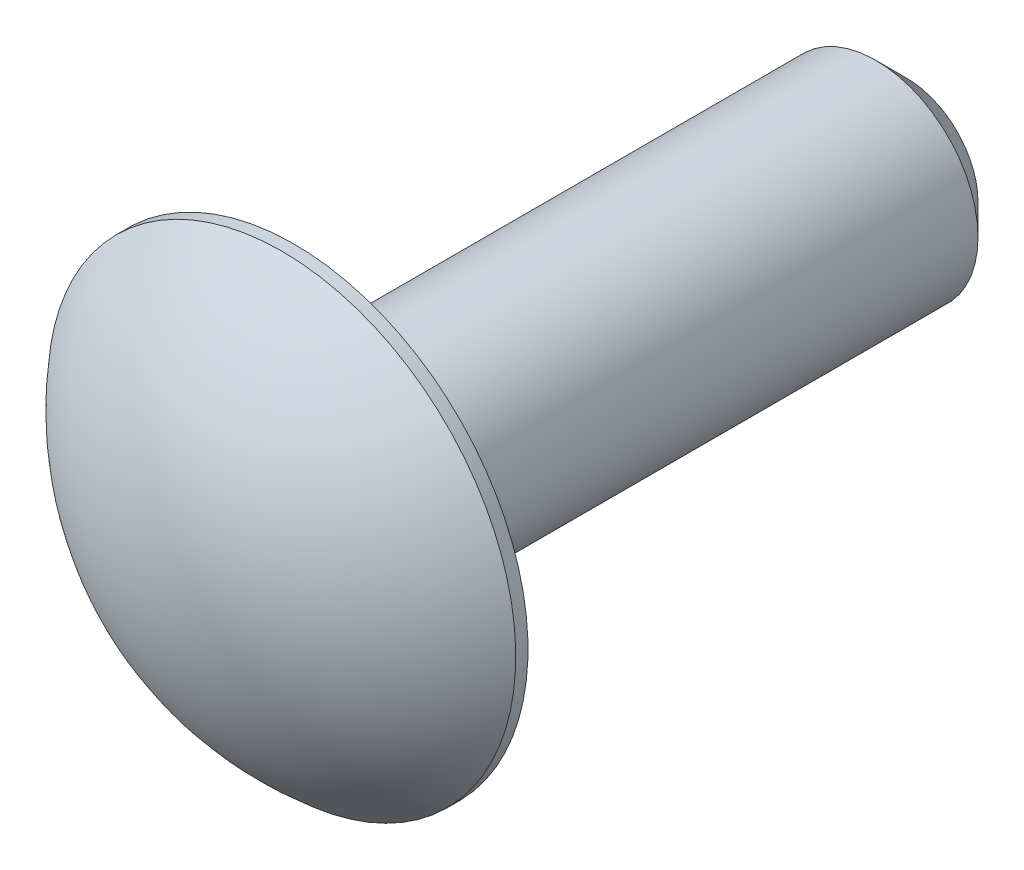
ISO-10303-21;
HEADER;
FILE_DESCRIPTION(('STEP AP214'),'2;1');
FILE_NAME('part.step','',(''),(''),'','','');
FILE_SCHEMA(('AUTOMOTIVE_DESIGN { 1 0 10303 214 1 1 1 1 }'));
ENDSEC;
DATA;
#1=APPLICATION_CONTEXT('core data for automotive mechanical design processes');
#2=APPLICATION_PROTOCOL_DEFINITION('international standard','automotive_design',2000,#1);
#3=PRODUCT_CONTEXT('',#1,'mechanical');
#4=PRODUCT('Part','Part','',(#3));
#5=PRODUCT_RELATED_PRODUCT_CATEGORY('part','',(#4));
#6=PRODUCT_DEFINITION_FORMATION('','',#4);
#7=PRODUCT_DEFINITION_CONTEXT('part definition',#1,'design');
#8=PRODUCT_DEFINITION('design','',#6,#7);
#9=PRODUCT_DEFINITION_SHAPE('','',#8);
#10=(LENGTH_UNIT() NAMED_UNIT(*) SI_UNIT(.MILLI.,.METRE.));
#11=(NAMED_UNIT(*) PLANE_ANGLE_UNIT() SI_UNIT($,.RADIAN.));
#12=(NAMED_UNIT(*) SI_UNIT($,.STERADIAN.) SOLID_ANGLE_UNIT());
#13=UNCERTAINTY_MEASURE_WITH_UNIT(LENGTH_MEASURE(1.E-05),#10,'distance_accuracy_value','');
#14=(GEOMETRIC_REPRESENTATION_CONTEXT(3) GLOBAL_UNCERTAINTY_ASSIGNED_CONTEXT((#13)) GLOBAL_UNIT_ASSIGNED_CONTEXT((#10,
#11,#12)) REPRESENTATION_CONTEXT('',''));
#15=CARTESIAN_POINT('',(0.,0.,0.));
#16=DIRECTION('',(0.,0.,1.));
#17=DIRECTION('',(1.,0.,0.));
#18=AXIS2_PLACEMENT_3D('',#15,#16,#17);
#19=CARTESIAN_POINT('',(0.,0.,0.));
#20=DIRECTION('',(0.,0.,1.));
#21=DIRECTION('',(1.,0.,0.));
#22=AXIS2_PLACEMENT_3D('',#19,#20,#21);
#23=PLANE('',#22);
#24=CARTESIAN_POINT('',(0.,0.,0.));
#25=DIRECTION('',(0.,0.,1.));
#26=DIRECTION('',(1.,0.,0.));
#27=AXIS2_PLACEMENT_3D('',#24,#25,#26);
#28=CIRCLE('',#27,7.2771);
#29=CARTESIAN_POINT('',(-7.2771,0.,0.));
#30=VERTEX_POINT('',#29);
#31=EDGE_CURVE('E47',#30,#30,#28,.T.);
#32=ORIENTED_EDGE('',*,*,#31,.F.);
#33=EDGE_LOOP('',(#32));
#34=FACE_BOUND('',#33,.T.);
#35=CARTESIAN_POINT('',(0.,0.,0.));
#36=DIRECTION('',(0.,0.,1.));
#37=DIRECTION('',(1.,0.,0.));
#38=AXIS2_PLACEMENT_3D('',#35,#36,#37);
#39=CIRCLE('',#38,3.175);
#40=CARTESIAN_POINT('',(3.175,0.,0.));
#41=VERTEX_POINT('',#40);
#42=EDGE_CURVE('E11',#41,#41,#39,.F.);
#43=ORIENTED_EDGE('',*,*,#42,.F.);
#44=EDGE_LOOP('',(#43));
#45=FACE_BOUND('',#44,.T.);
#46=ADVANCED_FACE('F39',(#34,#45),#23,.F.);
#47=CARTESIAN_POINT('',(0.,0.,3.81));
#48=DIRECTION('',(0.,0.,-1.));
#49=DIRECTION('',(-1.,0.,0.));
#50=AXIS2_PLACEMENT_3D('',#47,#48,#49);
#51=CYLINDRICAL_SURFACE('',#50,7.2771);
#52=CARTESIAN_POINT('',(0.,0.,0.380999999999999));
#53=DIRECTION('',(0.,0.,-1.));
#54=DIRECTION('',(0.,1.,0.));
#55=AXIS2_PLACEMENT_3D('',#52,#53,#54);
#56=CIRCLE('',#55,7.2771);
#57=CARTESIAN_POINT('',(-7.2771,0.,0.380999999999999));
#58=VERTEX_POINT('',#57);
#59=EDGE_CURVE('E57',#58,#58,#56,.T.);
#60=CARTESIAN_POINT('',(-7.2771,0.,0.380999999999999));
#61=CARTESIAN_POINT('',(-7.2771,0.,0.377031249999999));
#62=CARTESIAN_POINT('',(-7.2771,0.,0.3730625));
#63=CARTESIAN_POINT('',(-7.2771,0.,0.365125));
#64=CARTESIAN_POINT('',(-7.2771,0.,0.36115625));
#65=CARTESIAN_POINT('',(-7.2771,0.,0.353218749999999));
#66=CARTESIAN_POINT('',(-7.2771,0.,0.349249999999999));
#67=CARTESIAN_POINT('',(-7.2771,0.,0.341312499999999));
#68=CARTESIAN_POINT('',(-7.2771,0.,0.337343749999999));
#69=CARTESIAN_POINT('',(-7.2771,0.,0.32940625));
#70=CARTESIAN_POINT('',(-7.2771,0.,0.3254375));
#71=CARTESIAN_POINT('',(-7.2771,0.,0.3175));
#72=CARTESIAN_POINT('',(-7.2771,0.,0.31353125));
#73=CARTESIAN_POINT('',(-7.2771,0.,0.305593749999999));
#74=CARTESIAN_POINT('',(-7.2771,0.,0.301624999999999));
#75=CARTESIAN_POINT('',(-7.2771,0.,0.293687499999999));
#76=CARTESIAN_POINT('',(-7.2771,0.,0.289718749999999));
#77=CARTESIAN_POINT('',(-7.2771,0.,0.28178125));
#78=CARTESIAN_POINT('',(-7.2771,0.,0.2778125));
#79=CARTESIAN_POINT('',(-7.2771,0.,0.269875));
#80=CARTESIAN_POINT('',(-7.2771,0.,0.26590625));
#81=CARTESIAN_POINT('',(-7.2771,0.,0.25796875));
#82=CARTESIAN_POINT('',(-7.2771,0.,0.253999999999999));
#83=CARTESIAN_POINT('',(-7.2771,0.,0.246062499999999));
#84=CARTESIAN_POINT('',(-7.2771,0.,0.24209375));
#85=CARTESIAN_POINT('',(-7.2771,0.,0.23415625));
#86=CARTESIAN_POINT('',(-7.2771,0.,0.2301875));
#87=CARTESIAN_POINT('',(-7.2771,0.,0.22225));
#88=CARTESIAN_POINT('',(-7.2771,0.,0.21828125));
#89=CARTESIAN_POINT('',(-7.2771,0.,0.21034375));
#90=CARTESIAN_POINT('',(-7.2771,0.,0.206375));
#91=CARTESIAN_POINT('',(-7.2771,0.,0.1984375));
#92=CARTESIAN_POINT('',(-7.2771,0.,0.19446875));
#93=CARTESIAN_POINT('',(-7.2771,0.,0.18653125));
#94=CARTESIAN_POINT('',(-7.2771,0.,0.1825625));
#95=CARTESIAN_POINT('',(-7.2771,0.,0.174625));
#96=CARTESIAN_POINT('',(-7.2771,0.,0.17065625));
#97=CARTESIAN_POINT('',(-7.2771,0.,0.16271875));
#98=CARTESIAN_POINT('',(-7.2771,0.,0.15875));
#99=CARTESIAN_POINT('',(-7.2771,0.,0.1508125));
#100=CARTESIAN_POINT('',(-7.2771,0.,0.14684375));
#101=CARTESIAN_POINT('',(-7.2771,0.,0.13890625));
#102=CARTESIAN_POINT('',(-7.2771,0.,0.1349375));
#103=CARTESIAN_POINT('',(-7.2771,0.,0.127));
#104=CARTESIAN_POINT('',(-7.2771,0.,0.12303125));
#105=CARTESIAN_POINT('',(-7.2771,0.,0.11509375));
#106=CARTESIAN_POINT('',(-7.2771,0.,0.111125));
#107=CARTESIAN_POINT('',(-7.2771,0.,0.1031875));
#108=CARTESIAN_POINT('',(-7.2771,0.,0.0992187499999998));
#109=CARTESIAN_POINT('',(-7.2771,0.,0.0912812499999999));
#110=CARTESIAN_POINT('',(-7.2771,0.,0.0873125));
#111=CARTESIAN_POINT('',(-7.2771,0.,0.079375));
#112=CARTESIAN_POINT('',(-7.2771,0.,0.07540625));
#113=CARTESIAN_POINT('',(-7.2771,0.,0.0674687499999998));
#114=CARTESIAN_POINT('',(-7.2771,0.,0.0634999999999998));
#115=CARTESIAN_POINT('',(-7.2771,0.,0.0555624999999998));
#116=CARTESIAN_POINT('',(-7.2771,0.,0.0515937499999998));
#117=CARTESIAN_POINT('',(-7.2771,0.,0.04365625));
#118=CARTESIAN_POINT('',(-7.2771,0.,0.0396875000000001));
#119=CARTESIAN_POINT('',(-7.2771,0.,0.0317500000000001));
#120=CARTESIAN_POINT('',(-7.2771,0.,0.02778125));
#121=CARTESIAN_POINT('',(-7.2771,0.,0.0198437499999999));
#122=CARTESIAN_POINT('',(-7.2771,0.,0.0158749999999998));
#123=CARTESIAN_POINT('',(-7.2771,0.,0.00793749999999984));
#124=CARTESIAN_POINT('',(-7.2771,0.,0.00396874999999992));
#125=CARTESIAN_POINT('',(-7.2771,0.,0.));
#126=B_SPLINE_CURVE_WITH_KNOTS('',3,(#60,#61,#62,#63,#64,#65,#66,#67,#68,#69,#70,#71,#72,#73,
#74,#75,#76,#77,#78,#79,#80,#81,#82,#83,#84,#85,#86,#87,#88,#89,#90,#91,#92,#93,#94,#95,#96,#97,
#98,#99,#100,#101,#102,#103,#104,#105,#106,#107,#108,#109,#110,#111,#112,#113,#114,#115,#116,
#117,#118,#119,#120,#121,#122,#123,#124,#125),.UNSPECIFIED.,.F.,.F.,(4,2,2,2,2,2,2,2,2,2,2,2,2,
2,2,2,2,2,2,2,2,2,2,2,2,2,2,2,2,2,2,2,4),(0.,0.0119062499999998,0.0238125,0.0357187500000002,
0.0476249999999999,0.0595312499999997,0.0714374999999999,0.0833437500000001,0.0952499999999998,
0.10715625,0.1190625,0.13096875,0.142875,0.15478125,0.1666875,0.17859375,0.1905,
0.202406249999999,0.2143125,0.22621875,0.238125,0.250031249999999,0.2619375,0.27384375,0.28575,
0.297656249999999,0.3095625,0.32146875,0.333374999999999,0.345281249999999,0.357187499999999,
0.36909375,0.380999999999999),.UNSPECIFIED.);
#127=EDGE_CURVE('BSEAM41',#58,#30,#126,.T.);
#128=ORIENTED_EDGE('',*,*,#59,.T.);
#129=ORIENTED_EDGE('',*,*,#31,.T.);
#130=ORIENTED_EDGE('',*,*,#127,.T.);
#131=ORIENTED_EDGE('',*,*,#127,.F.);
#132=EDGE_LOOP('',(#128,#130,#129,#131));
#133=FACE_BOUND('',#132,.T.);
#134=ADVANCED_FACE('F41',(#133),#51,.T.);
#135=CARTESIAN_POINT('',(0.,0.,-5.62631166666666));
#136=DIRECTION('',(0.,0.,-1.));
#137=DIRECTION('',(0.,1.,0.));
#138=AXIS2_PLACEMENT_3D('',#135,#136,#137);
#139=SPHERICAL_SURFACE('',#138,9.43631166666666);
#140=CARTESIAN_POINT('',(0.,0.,3.81));
#141=VERTEX_POINT('',#140);
#142=VERTEX_LOOP('',#141);
#143=FACE_BOUND('',#142,.T.);
#144=ORIENTED_EDGE('',*,*,#59,.F.);
#145=EDGE_LOOP('',(#144));
#146=FACE_BOUND('',#145,.T.);
#147=ADVANCED_FACE('F50',(#143,#146),#139,.T.);
#148=CARTESIAN_POINT('',(0.,0.,-19.05));
#149=DIRECTION('',(0.,0.,1.));
#150=DIRECTION('',(1.,0.,0.));
#151=AXIS2_PLACEMENT_3D('',#148,#149,#150);
#152=PLANE('',#151);
#153=CARTESIAN_POINT('',(0.,0.,-19.05));
#154=DIRECTION('',(0.,0.,1.));
#155=DIRECTION('',(1.,0.,0.));
#156=AXIS2_PLACEMENT_3D('',#153,#154,#155);
#157=CIRCLE('',#156,2.2225);
#158=CARTESIAN_POINT('',(2.2225,0.,-19.05));
#159=VERTEX_POINT('',#158);
#160=EDGE_CURVE('E60',#159,#159,#157,.F.);
#161=ORIENTED_EDGE('',*,*,#160,.T.);
#162=EDGE_LOOP('',(#161));
#163=FACE_BOUND('',#162,.T.);
#164=ADVANCED_FACE('F53',(#163),#152,.F.);
#165=CARTESIAN_POINT('',(0.,0.,0.));
#166=DIRECTION('',(0.,0.,1.));
#167=DIRECTION('',(1.,0.,0.));
#168=AXIS2_PLACEMENT_3D('',#165,#166,#167);
#169=CYLINDRICAL_SURFACE('',#168,3.175);
#170=CARTESIAN_POINT('',(0.,0.,-18.0975));
#171=DIRECTION('',(0.,0.,1.));
#172=DIRECTION('',(1.,0.,0.));
#173=AXIS2_PLACEMENT_3D('',#170,#171,#172);
#174=CIRCLE('',#173,3.175);
#175=CARTESIAN_POINT('',(3.175,0.,-18.0975));
#176=VERTEX_POINT('',#175);
#177=EDGE_CURVE('E66',#176,#176,#174,.T.);
#178=ORIENTED_EDGE('',*,*,#177,.T.);
#179=EDGE_LOOP('',(#178));
#180=FACE_BOUND('',#179,.T.);
#181=ORIENTED_EDGE('',*,*,#42,.T.);
#182=EDGE_LOOP('',(#181));
#183=FACE_BOUND('',#182,.T.);
#184=ADVANCED_FACE('F73',(#180,#183),#169,.T.);
#185=CARTESIAN_POINT('',(0.,0.,-18.0975));
#186=DIRECTION('',(0.,0.,1.));
#187=DIRECTION('',(1.,0.,0.));
#188=AXIS2_PLACEMENT_3D('',#185,#186,#187);
#189=CONICAL_SURFACE('',#188,3.175,0.785398163397451);
#190=ORIENTED_EDGE('',*,*,#160,.F.);
#191=EDGE_LOOP('',(#190));
#192=FACE_BOUND('',#191,.T.);
#193=ORIENTED_EDGE('',*,*,#177,.F.);
#194=EDGE_LOOP('',(#193));
#195=FACE_BOUND('',#194,.T.);
#196=ADVANCED_FACE('F76',(#192,#195),#189,.T.);
#197=CLOSED_SHELL('',(#46,#134,#147,#164,#184,#196));
#198=MANIFOLD_SOLID_BREP('B2',#197);
#199=ADVANCED_BREP_SHAPE_REPRESENTATION('',(#18,#198),#14);
#200=SHAPE_DEFINITION_REPRESENTATION(#9,#199);
ENDSEC;
END-ISO-10303-21;
